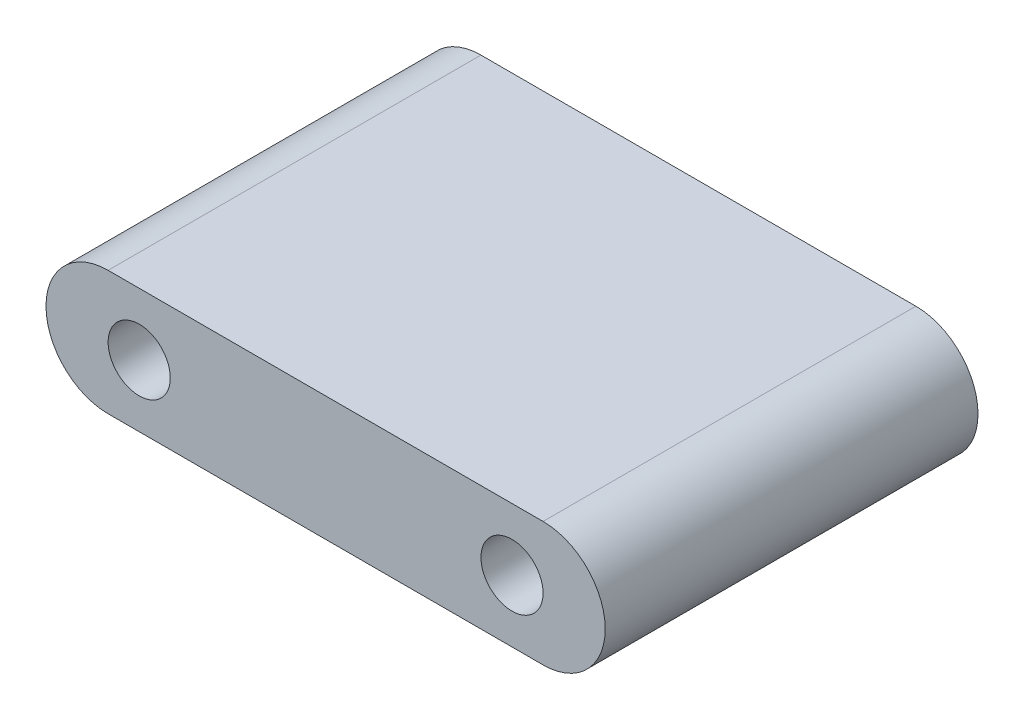
ISO-10303-21;
HEADER;
FILE_DESCRIPTION(('STEP AP214'),'2;1');
FILE_NAME('part.step','',(''),(''),'','','');
FILE_SCHEMA(('AUTOMOTIVE_DESIGN { 1 0 10303 214 1 1 1 1 }'));
ENDSEC;
DATA;
#1=APPLICATION_CONTEXT('core data for automotive mechanical design processes');
#2=APPLICATION_PROTOCOL_DEFINITION('international standard','automotive_design',2000,#1);
#3=PRODUCT_CONTEXT('',#1,'mechanical');
#4=PRODUCT('Part','Part','',(#3));
#5=PRODUCT_RELATED_PRODUCT_CATEGORY('part','',(#4));
#6=PRODUCT_DEFINITION_FORMATION('','',#4);
#7=PRODUCT_DEFINITION_CONTEXT('part definition',#1,'design');
#8=PRODUCT_DEFINITION('design','',#6,#7);
#9=PRODUCT_DEFINITION_SHAPE('','',#8);
#10=(LENGTH_UNIT() NAMED_UNIT(*) SI_UNIT(.MILLI.,.METRE.));
#11=(NAMED_UNIT(*) PLANE_ANGLE_UNIT() SI_UNIT($,.RADIAN.));
#12=(NAMED_UNIT(*) SI_UNIT($,.STERADIAN.) SOLID_ANGLE_UNIT());
#13=UNCERTAINTY_MEASURE_WITH_UNIT(LENGTH_MEASURE(1.E-05),#10,'distance_accuracy_value','');
#14=(GEOMETRIC_REPRESENTATION_CONTEXT(3) GLOBAL_UNCERTAINTY_ASSIGNED_CONTEXT((#13)) GLOBAL_UNIT_ASSIGNED_CONTEXT((#10,
#11,#12)) REPRESENTATION_CONTEXT('',''));
#15=CARTESIAN_POINT('',(0.,0.,0.));
#16=DIRECTION('',(0.,0.,1.));
#17=DIRECTION('',(1.,0.,0.));
#18=AXIS2_PLACEMENT_3D('',#15,#16,#17);
#19=CARTESIAN_POINT('',(-15.,0.,15.));
#20=DIRECTION('',(0.,0.,-1.));
#21=DIRECTION('',(-1.,0.,0.));
#22=AXIS2_PLACEMENT_3D('',#19,#20,#21);
#23=CYLINDRICAL_SURFACE('',#22,1.6);
#24=CARTESIAN_POINT('',(-15.,0.,-15.));
#25=DIRECTION('',(0.,0.,1.));
#26=DIRECTION('',(1.,0.,0.));
#27=AXIS2_PLACEMENT_3D('',#24,#25,#26);
#28=CIRCLE('',#27,1.6);
#29=CARTESIAN_POINT('',(-13.4,0.,-15.));
#30=VERTEX_POINT('',#29);
#31=EDGE_CURVE('E92',#30,#30,#28,.T.);
#32=ORIENTED_EDGE('',*,*,#31,.F.);
#33=EDGE_LOOP('',(#32));
#34=FACE_BOUND('',#33,.T.);
#35=CARTESIAN_POINT('',(-15.,0.,0.));
#36=DIRECTION('',(0.,0.,1.));
#37=DIRECTION('',(1.,0.,0.));
#38=AXIS2_PLACEMENT_3D('',#35,#36,#37);
#39=CIRCLE('',#38,1.6);
#40=CARTESIAN_POINT('',(-13.4,0.,0.));
#41=VERTEX_POINT('',#40);
#42=EDGE_CURVE('E134',#41,#41,#39,.T.);
#43=ORIENTED_EDGE('',*,*,#42,.T.);
#44=EDGE_LOOP('',(#43));
#45=FACE_BOUND('',#44,.T.);
#46=ADVANCED_FACE('F43',(#34,#45),#23,.F.);
#47=CARTESIAN_POINT('',(15.,0.,15.));
#48=DIRECTION('',(0.,0.,-1.));
#49=DIRECTION('',(-1.,0.,0.));
#50=AXIS2_PLACEMENT_3D('',#47,#48,#49);
#51=CYLINDRICAL_SURFACE('',#50,1.6);
#52=CARTESIAN_POINT('',(15.,0.,-15.));
#53=DIRECTION('',(0.,0.,1.));
#54=DIRECTION('',(-1.,0.,0.));
#55=AXIS2_PLACEMENT_3D('',#52,#53,#54);
#56=CIRCLE('',#55,1.6);
#57=CARTESIAN_POINT('',(13.4,0.,-15.));
#58=VERTEX_POINT('',#57);
#59=EDGE_CURVE('E125',#58,#58,#56,.T.);
#60=ORIENTED_EDGE('',*,*,#59,.F.);
#61=EDGE_LOOP('',(#60));
#62=FACE_BOUND('',#61,.T.);
#63=CARTESIAN_POINT('',(15.,0.,0.));
#64=DIRECTION('',(0.,0.,1.));
#65=DIRECTION('',(1.,0.,0.));
#66=AXIS2_PLACEMENT_3D('',#63,#64,#65);
#67=CIRCLE('',#66,1.6);
#68=CARTESIAN_POINT('',(16.6,0.,0.));
#69=VERTEX_POINT('',#68);
#70=EDGE_CURVE('E48',#69,#69,#67,.T.);
#71=ORIENTED_EDGE('',*,*,#70,.T.);
#72=EDGE_LOOP('',(#71));
#73=FACE_BOUND('',#72,.T.);
#74=ADVANCED_FACE('F178',(#62,#73),#51,.F.);
#75=CARTESIAN_POINT('',(17.5,0.,15.));
#76=DIRECTION('',(0.,0.,-1.));
#77=DIRECTION('',(-1.,0.,0.));
#78=AXIS2_PLACEMENT_3D('',#75,#76,#77);
#79=CYLINDRICAL_SURFACE('',#78,5.);
#80=DIRECTION('',(0.,0.,-1.));
#81=VECTOR('',#80,1.);
#82=CARTESIAN_POINT('',(17.5,4.99999999999999,15.));
#83=LINE('',#82,#81);
#84=CARTESIAN_POINT('',(17.5,4.99999999999999,15.));
#85=VERTEX_POINT('',#84);
#86=CARTESIAN_POINT('',(17.5,4.99999999999999,-15.));
#87=VERTEX_POINT('',#86);
#88=EDGE_CURVE('E90',#85,#87,#83,.T.);
#89=ORIENTED_EDGE('',*,*,#88,.F.);
#90=CARTESIAN_POINT('',(17.5,0.,15.));
#91=DIRECTION('',(0.,0.,-1.));
#92=DIRECTION('',(-1.,0.,0.));
#93=AXIS2_PLACEMENT_3D('',#90,#91,#92);
#94=CIRCLE('',#93,5.);
#95=CARTESIAN_POINT('',(17.5,-5.,15.));
#96=VERTEX_POINT('',#95);
#97=EDGE_CURVE('E53',#96,#85,#94,.F.);
#98=ORIENTED_EDGE('',*,*,#97,.F.);
#99=DIRECTION('',(0.,0.,-1.));
#100=VECTOR('',#99,1.);
#101=CARTESIAN_POINT('',(17.5,-5.,15.));
#102=LINE('',#101,#100);
#103=CARTESIAN_POINT('',(17.5,-5.,-15.));
#104=VERTEX_POINT('',#103);
#105=EDGE_CURVE('E116',#104,#96,#102,.F.);
#106=ORIENTED_EDGE('',*,*,#105,.F.);
#107=CARTESIAN_POINT('',(17.5,0.,-15.));
#108=DIRECTION('',(0.,0.,-1.));
#109=DIRECTION('',(-1.,0.,0.));
#110=AXIS2_PLACEMENT_3D('',#107,#108,#109);
#111=CIRCLE('',#110,5.);
#112=EDGE_CURVE('E12',#87,#104,#111,.T.);
#113=ORIENTED_EDGE('',*,*,#112,.F.);
#114=EDGE_LOOP('',(#89,#98,#106,#113));
#115=FACE_BOUND('',#114,.T.);
#116=ADVANCED_FACE('F46',(#115),#79,.T.);
#117=CARTESIAN_POINT('',(-17.5,0.,-15.));
#118=DIRECTION('',(0.,0.,-1.));
#119=DIRECTION('',(-1.,0.,0.));
#120=AXIS2_PLACEMENT_3D('',#117,#118,#119);
#121=CYLINDRICAL_SURFACE('',#120,5.);
#122=DIRECTION('',(0.,0.,-1.));
#123=VECTOR('',#122,1.);
#124=CARTESIAN_POINT('',(-17.5,4.99999999999999,15.));
#125=LINE('',#124,#123);
#126=CARTESIAN_POINT('',(-17.5,4.99999999999999,-15.));
#127=VERTEX_POINT('',#126);
#128=CARTESIAN_POINT('',(-17.5,4.99999999999999,15.));
#129=VERTEX_POINT('',#128);
#130=EDGE_CURVE('E89',#127,#129,#125,.F.);
#131=ORIENTED_EDGE('',*,*,#130,.F.);
#132=CARTESIAN_POINT('',(-17.5,0.,-15.));
#133=DIRECTION('',(0.,0.,-1.));
#134=DIRECTION('',(-1.,0.,0.));
#135=AXIS2_PLACEMENT_3D('',#132,#133,#134);
#136=CIRCLE('',#135,5.);
#137=CARTESIAN_POINT('',(-17.5,-5.,-15.));
#138=VERTEX_POINT('',#137);
#139=EDGE_CURVE('E94',#138,#127,#136,.T.);
#140=ORIENTED_EDGE('',*,*,#139,.F.);
#141=DIRECTION('',(0.,0.,-1.));
#142=VECTOR('',#141,1.);
#143=CARTESIAN_POINT('',(-17.5,-5.,15.));
#144=LINE('',#143,#142);
#145=CARTESIAN_POINT('',(-17.5,-5.,15.));
#146=VERTEX_POINT('',#145);
#147=EDGE_CURVE('E102',#146,#138,#144,.T.);
#148=ORIENTED_EDGE('',*,*,#147,.F.);
#149=CARTESIAN_POINT('',(-17.5,0.,15.));
#150=DIRECTION('',(0.,0.,-1.));
#151=DIRECTION('',(-1.,0.,0.));
#152=AXIS2_PLACEMENT_3D('',#149,#150,#151);
#153=CIRCLE('',#152,5.);
#154=EDGE_CURVE('E101',#129,#146,#153,.F.);
#155=ORIENTED_EDGE('',*,*,#154,.F.);
#156=EDGE_LOOP('',(#131,#140,#148,#155));
#157=FACE_BOUND('',#156,.T.);
#158=ADVANCED_FACE('F105',(#157),#121,.T.);
#159=CARTESIAN_POINT('',(0.,0.,15.));
#160=DIRECTION('',(0.,0.,-1.));
#161=DIRECTION('',(-1.,0.,0.));
#162=AXIS2_PLACEMENT_3D('',#159,#160,#161);
#163=PLANE('',#162);
#164=CARTESIAN_POINT('',(-15.,0.,15.));
#165=DIRECTION('',(0.,0.,1.));
#166=DIRECTION('',(1.,0.,0.));
#167=AXIS2_PLACEMENT_3D('',#164,#165,#166);
#168=CIRCLE('',#167,2.5);
#169=CARTESIAN_POINT('',(-12.5,0.,15.));
#170=VERTEX_POINT('',#169);
#171=EDGE_CURVE('E135',#170,#170,#168,.T.);
#172=ORIENTED_EDGE('',*,*,#171,.F.);
#173=EDGE_LOOP('',(#172));
#174=FACE_BOUND('',#173,.T.);
#175=CARTESIAN_POINT('',(15.,0.,15.));
#176=DIRECTION('',(0.,0.,1.));
#177=DIRECTION('',(1.,0.,0.));
#178=AXIS2_PLACEMENT_3D('',#175,#176,#177);
#179=CIRCLE('',#178,2.5);
#180=CARTESIAN_POINT('',(17.5,0.,15.));
#181=VERTEX_POINT('',#180);
#182=EDGE_CURVE('E131',#181,#181,#179,.T.);
#183=ORIENTED_EDGE('',*,*,#182,.F.);
#184=EDGE_LOOP('',(#183));
#185=FACE_BOUND('',#184,.T.);
#186=DIRECTION('',(1.,0.,0.));
#187=VECTOR('',#186,1.);
#188=CARTESIAN_POINT('',(-22.5,-5.,15.));
#189=LINE('',#188,#187);
#190=EDGE_CURVE('E106',#146,#96,#189,.T.);
#191=ORIENTED_EDGE('',*,*,#190,.T.);
#192=ORIENTED_EDGE('',*,*,#97,.T.);
#193=DIRECTION('',(-1.,0.,0.));
#194=VECTOR('',#193,1.);
#195=CARTESIAN_POINT('',(-22.5,4.99999999999999,15.));
#196=LINE('',#195,#194);
#197=EDGE_CURVE('E110',#85,#129,#196,.T.);
#198=ORIENTED_EDGE('',*,*,#197,.T.);
#199=ORIENTED_EDGE('',*,*,#154,.T.);
#200=EDGE_LOOP('',(#191,#192,#198,#199));
#201=FACE_BOUND('',#200,.T.);
#202=ADVANCED_FACE('F119',(#174,#185,#201),#163,.F.);
#203=CARTESIAN_POINT('',(0.,0.,-15.));
#204=DIRECTION('',(0.,0.,-1.));
#205=DIRECTION('',(-1.,0.,0.));
#206=AXIS2_PLACEMENT_3D('',#203,#204,#205);
#207=PLANE('',#206);
#208=ORIENTED_EDGE('',*,*,#31,.T.);
#209=EDGE_LOOP('',(#208));
#210=FACE_BOUND('',#209,.T.);
#211=DIRECTION('',(-1.,0.,0.));
#212=VECTOR('',#211,1.);
#213=CARTESIAN_POINT('',(-22.5,4.99999999999999,-15.));
#214=LINE('',#213,#212);
#215=EDGE_CURVE('E84',#87,#127,#214,.T.);
#216=ORIENTED_EDGE('',*,*,#215,.F.);
#217=ORIENTED_EDGE('',*,*,#112,.T.);
#218=DIRECTION('',(1.,0.,0.));
#219=VECTOR('',#218,1.);
#220=CARTESIAN_POINT('',(-22.5,-5.,-15.));
#221=LINE('',#220,#219);
#222=EDGE_CURVE('E91',#138,#104,#221,.T.);
#223=ORIENTED_EDGE('',*,*,#222,.F.);
#224=ORIENTED_EDGE('',*,*,#139,.T.);
#225=EDGE_LOOP('',(#216,#217,#223,#224));
#226=FACE_BOUND('',#225,.T.);
#227=ORIENTED_EDGE('',*,*,#59,.T.);
#228=EDGE_LOOP('',(#227));
#229=FACE_BOUND('',#228,.T.);
#230=ADVANCED_FACE('F95',(#210,#226,#229),#207,.T.);
#231=CARTESIAN_POINT('',(-22.5,4.99999999999999,15.));
#232=DIRECTION('',(0.,-1.,0.));
#233=DIRECTION('',(1.,0.,0.));
#234=AXIS2_PLACEMENT_3D('',#231,#232,#233);
#235=PLANE('',#234);
#236=ORIENTED_EDGE('',*,*,#197,.F.);
#237=ORIENTED_EDGE('',*,*,#88,.T.);
#238=ORIENTED_EDGE('',*,*,#215,.T.);
#239=ORIENTED_EDGE('',*,*,#130,.T.);
#240=EDGE_LOOP('',(#236,#237,#238,#239));
#241=FACE_BOUND('',#240,.T.);
#242=ADVANCED_FACE('F87',(#241),#235,.F.);
#243=CARTESIAN_POINT('',(-22.5,-5.,15.));
#244=DIRECTION('',(0.,1.,0.));
#245=DIRECTION('',(-1.,0.,0.));
#246=AXIS2_PLACEMENT_3D('',#243,#244,#245);
#247=PLANE('',#246);
#248=ORIENTED_EDGE('',*,*,#222,.T.);
#249=ORIENTED_EDGE('',*,*,#105,.T.);
#250=ORIENTED_EDGE('',*,*,#190,.F.);
#251=ORIENTED_EDGE('',*,*,#147,.T.);
#252=EDGE_LOOP('',(#248,#249,#250,#251));
#253=FACE_BOUND('',#252,.T.);
#254=ADVANCED_FACE('F165',(#253),#247,.F.);
#255=CARTESIAN_POINT('',(15.,0.,0.));
#256=DIRECTION('',(0.,0.,1.));
#257=DIRECTION('',(1.,0.,0.));
#258=AXIS2_PLACEMENT_3D('',#255,#256,#257);
#259=CYLINDRICAL_SURFACE('',#258,2.5);
#260=CARTESIAN_POINT('',(15.,0.,0.));
#261=DIRECTION('',(0.,0.,1.));
#262=DIRECTION('',(1.,0.,0.));
#263=AXIS2_PLACEMENT_3D('',#260,#261,#262);
#264=CIRCLE('',#263,2.5);
#265=CARTESIAN_POINT('',(17.5,0.,0.));
#266=VERTEX_POINT('',#265);
#267=EDGE_CURVE('E128',#266,#266,#264,.T.);
#268=ORIENTED_EDGE('',*,*,#267,.F.);
#269=EDGE_LOOP('',(#268));
#270=FACE_BOUND('',#269,.T.);
#271=ORIENTED_EDGE('',*,*,#182,.T.);
#272=EDGE_LOOP('',(#271));
#273=FACE_BOUND('',#272,.T.);
#274=ADVANCED_FACE('F163',(#270,#273),#259,.F.);
#275=CARTESIAN_POINT('',(15.,0.,0.));
#276=DIRECTION('',(0.,0.,1.));
#277=DIRECTION('',(1.,0.,0.));
#278=AXIS2_PLACEMENT_3D('',#275,#276,#277);
#279=PLANE('',#278);
#280=ORIENTED_EDGE('',*,*,#70,.F.);
#281=EDGE_LOOP('',(#280));
#282=FACE_BOUND('',#281,.T.);
#283=ORIENTED_EDGE('',*,*,#267,.T.);
#284=EDGE_LOOP('',(#283));
#285=FACE_BOUND('',#284,.T.);
#286=ADVANCED_FACE('F154',(#282,#285),#279,.T.);
#287=CARTESIAN_POINT('',(-15.,0.,0.));
#288=DIRECTION('',(0.,0.,1.));
#289=DIRECTION('',(1.,0.,0.));
#290=AXIS2_PLACEMENT_3D('',#287,#288,#289);
#291=CYLINDRICAL_SURFACE('',#290,2.5);
#292=CARTESIAN_POINT('',(-15.,0.,0.));
#293=DIRECTION('',(0.,0.,1.));
#294=DIRECTION('',(1.,0.,0.));
#295=AXIS2_PLACEMENT_3D('',#292,#293,#294);
#296=CIRCLE('',#295,2.5);
#297=CARTESIAN_POINT('',(-12.5,0.,0.));
#298=VERTEX_POINT('',#297);
#299=EDGE_CURVE('E138',#298,#298,#296,.T.);
#300=ORIENTED_EDGE('',*,*,#299,.F.);
#301=EDGE_LOOP('',(#300));
#302=FACE_BOUND('',#301,.T.);
#303=ORIENTED_EDGE('',*,*,#171,.T.);
#304=EDGE_LOOP('',(#303));
#305=FACE_BOUND('',#304,.T.);
#306=ADVANCED_FACE('F148',(#302,#305),#291,.F.);
#307=CARTESIAN_POINT('',(-15.,0.,0.));
#308=DIRECTION('',(0.,0.,1.));
#309=DIRECTION('',(1.,0.,0.));
#310=AXIS2_PLACEMENT_3D('',#307,#308,#309);
#311=PLANE('',#310);
#312=ORIENTED_EDGE('',*,*,#42,.F.);
#313=EDGE_LOOP('',(#312));
#314=FACE_BOUND('',#313,.T.);
#315=ORIENTED_EDGE('',*,*,#299,.T.);
#316=EDGE_LOOP('',(#315));
#317=FACE_BOUND('',#316,.T.);
#318=ADVANCED_FACE('F145',(#314,#317),#311,.T.);
#319=CLOSED_SHELL('',(#46,#74,#116,#158,#202,#230,#242,#254,#274,#286,#306,#318));
#320=MANIFOLD_SOLID_BREP('B2',#319);
#321=ADVANCED_BREP_SHAPE_REPRESENTATION('',(#18,#320),#14);
#322=SHAPE_DEFINITION_REPRESENTATION(#9,#321);
ENDSEC;
END-ISO-10303-21;
